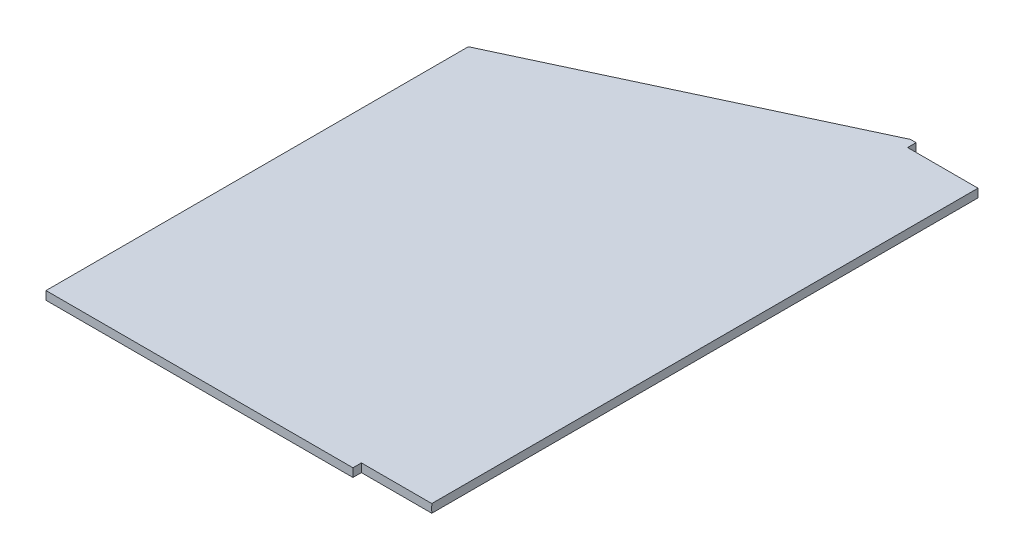
ISO-10303-21;
HEADER;
FILE_DESCRIPTION(('STEP AP214'),'2;1');
FILE_NAME('part.step','',(''),(''),'','','');
FILE_SCHEMA(('AUTOMOTIVE_DESIGN { 1 0 10303 214 1 1 1 1 }'));
ENDSEC;
DATA;
#1=APPLICATION_CONTEXT('core data for automotive mechanical design processes');
#2=APPLICATION_PROTOCOL_DEFINITION('international standard','automotive_design',2000,#1);
#3=PRODUCT_CONTEXT('',#1,'mechanical');
#4=PRODUCT('Part','Part','',(#3));
#5=PRODUCT_RELATED_PRODUCT_CATEGORY('part','',(#4));
#6=PRODUCT_DEFINITION_FORMATION('','',#4);
#7=PRODUCT_DEFINITION_CONTEXT('part definition',#1,'design');
#8=PRODUCT_DEFINITION('design','',#6,#7);
#9=PRODUCT_DEFINITION_SHAPE('','',#8);
#10=(LENGTH_UNIT() NAMED_UNIT(*) SI_UNIT(.MILLI.,.METRE.));
#11=(NAMED_UNIT(*) PLANE_ANGLE_UNIT() SI_UNIT($,.RADIAN.));
#12=(NAMED_UNIT(*) SI_UNIT($,.STERADIAN.) SOLID_ANGLE_UNIT());
#13=UNCERTAINTY_MEASURE_WITH_UNIT(LENGTH_MEASURE(1.E-05),#10,'distance_accuracy_value','');
#14=(GEOMETRIC_REPRESENTATION_CONTEXT(3) GLOBAL_UNCERTAINTY_ASSIGNED_CONTEXT((#13)) GLOBAL_UNIT_ASSIGNED_CONTEXT((#10,
#11,#12)) REPRESENTATION_CONTEXT('',''));
#15=CARTESIAN_POINT('',(0.,0.,0.));
#16=DIRECTION('',(0.,0.,1.));
#17=DIRECTION('',(1.,0.,0.));
#18=AXIS2_PLACEMENT_3D('',#15,#16,#17);
#19=CARTESIAN_POINT('',(78.2,0.,0.));
#20=DIRECTION('',(0.,0.,-1.));
#21=DIRECTION('',(-1.,0.,0.));
#22=AXIS2_PLACEMENT_3D('',#19,#20,#21);
#23=CYLINDRICAL_SURFACE('',#22,51.2);
#24=CARTESIAN_POINT('',(78.2,0.,-3.));
#25=DIRECTION('',(0.,0.,1.));
#26=DIRECTION('',(1.,0.,0.));
#27=AXIS2_PLACEMENT_3D('',#24,#25,#26);
#28=CIRCLE('',#27,51.2);
#29=CARTESIAN_POINT('',(27.021977373095,-1.5,-3.));
#30=VERTEX_POINT('',#29);
#31=CARTESIAN_POINT('',(27.021977373095,1.5,-3.));
#32=VERTEX_POINT('',#31);
#33=EDGE_CURVE('E55',#30,#32,#28,.F.);
#34=ORIENTED_EDGE('',*,*,#33,.F.);
#35=DIRECTION('',(0.,0.,-1.));
#36=VECTOR('',#35,1.);
#37=CARTESIAN_POINT('',(27.021977373095,-1.5,0.));
#38=LINE('',#37,#36);
#39=CARTESIAN_POINT('',(27.021977373095,-1.5,-197.));
#40=VERTEX_POINT('',#39);
#41=EDGE_CURVE('E165',#40,#30,#38,.F.);
#42=ORIENTED_EDGE('',*,*,#41,.F.);
#43=CARTESIAN_POINT('',(78.2,0.,-197.));
#44=DIRECTION('',(0.,0.,-1.));
#45=DIRECTION('',(-1.,0.,0.));
#46=AXIS2_PLACEMENT_3D('',#43,#44,#45);
#47=CIRCLE('',#46,51.2);
#48=CARTESIAN_POINT('',(27.021977373095,1.5,-197.));
#49=VERTEX_POINT('',#48);
#50=EDGE_CURVE('E158',#49,#40,#47,.F.);
#51=ORIENTED_EDGE('',*,*,#50,.F.);
#52=DIRECTION('',(0.,0.,-1.));
#53=VECTOR('',#52,1.);
#54=CARTESIAN_POINT('',(27.021977373095,1.5,0.));
#55=LINE('',#54,#53);
#56=EDGE_CURVE('E152',#49,#32,#55,.F.);
#57=ORIENTED_EDGE('',*,*,#56,.T.);
#58=EDGE_LOOP('',(#34,#42,#51,#57));
#59=FACE_BOUND('',#58,.T.);
#60=ADVANCED_FACE('F40',(#59),#23,.F.);
#61=CARTESIAN_POINT('',(0.,-1.5,-200.));
#62=DIRECTION('',(-0.423348930736044,0.,-0.905966711775134));
#63=DIRECTION('',(-0.905966711775134,0.,0.423348930736044));
#64=AXIS2_PLACEMENT_3D('',#61,#62,#63);
#65=PLANE('',#64);
#66=DIRECTION('',(0.,1.,0.));
#67=VECTOR('',#66,1.);
#68=CARTESIAN_POINT('',(-107.,-1.5,-150.));
#69=LINE('',#68,#67);
#70=CARTESIAN_POINT('',(-107.,-1.5,-150.));
#71=VERTEX_POINT('',#70);
#72=CARTESIAN_POINT('',(-107.,1.5,-150.));
#73=VERTEX_POINT('',#72);
#74=EDGE_CURVE('E148',#71,#73,#69,.T.);
#75=ORIENTED_EDGE('',*,*,#74,.T.);
#76=DIRECTION('',(-0.905966711775134,0.,0.423348930736044));
#77=VECTOR('',#76,1.);
#78=CARTESIAN_POINT('',(0.,1.5,-200.));
#79=LINE('',#78,#77);
#80=CARTESIAN_POINT('',(0.,1.5,-200.));
#81=VERTEX_POINT('',#80);
#82=EDGE_CURVE('E136',#81,#73,#79,.T.);
#83=ORIENTED_EDGE('',*,*,#82,.F.);
#84=DIRECTION('',(0.,1.,0.));
#85=VECTOR('',#84,1.);
#86=CARTESIAN_POINT('',(0.,-1.5,-200.));
#87=LINE('',#86,#85);
#88=CARTESIAN_POINT('',(0.,-1.5,-200.));
#89=VERTEX_POINT('',#88);
#90=EDGE_CURVE('E149',#89,#81,#87,.T.);
#91=ORIENTED_EDGE('',*,*,#90,.F.);
#92=DIRECTION('',(-0.905966711775134,0.,0.423348930736044));
#93=VECTOR('',#92,1.);
#94=CARTESIAN_POINT('',(0.,-1.5,-200.));
#95=LINE('',#94,#93);
#96=EDGE_CURVE('E134',#89,#71,#95,.T.);
#97=ORIENTED_EDGE('',*,*,#96,.T.);
#98=EDGE_LOOP('',(#75,#83,#91,#97));
#99=FACE_BOUND('',#98,.T.);
#100=ADVANCED_FACE('F42',(#99),#65,.T.);
#101=CARTESIAN_POINT('',(0.,-1.5,-200.));
#102=DIRECTION('',(0.,0.,-1.));
#103=DIRECTION('',(-1.,0.,0.));
#104=AXIS2_PLACEMENT_3D('',#101,#102,#103);
#105=PLANE('',#104);
#106=CARTESIAN_POINT('',(78.2,0.,-200.));
#107=DIRECTION('',(0.,0.,-1.));
#108=DIRECTION('',(-1.,0.,0.));
#109=AXIS2_PLACEMENT_3D('',#106,#107,#108);
#110=CIRCLE('',#109,76.2);
#111=CARTESIAN_POINT('',(2.01476521004874,-1.5,-200.));
#112=VERTEX_POINT('',#111);
#113=CARTESIAN_POINT('',(2.01476521004874,1.5,-200.));
#114=VERTEX_POINT('',#113);
#115=EDGE_CURVE('E193',#112,#114,#110,.T.);
#116=ORIENTED_EDGE('',*,*,#115,.F.);
#117=DIRECTION('',(-1.,0.,0.));
#118=VECTOR('',#117,1.);
#119=CARTESIAN_POINT('',(0.,-1.5,-200.));
#120=LINE('',#119,#118);
#121=EDGE_CURVE('E146',#112,#89,#120,.T.);
#122=ORIENTED_EDGE('',*,*,#121,.T.);
#123=ORIENTED_EDGE('',*,*,#90,.T.);
#124=DIRECTION('',(-1.,0.,0.));
#125=VECTOR('',#124,1.);
#126=CARTESIAN_POINT('',(0.,1.5,-200.));
#127=LINE('',#126,#125);
#128=EDGE_CURVE('E132',#114,#81,#127,.T.);
#129=ORIENTED_EDGE('',*,*,#128,.F.);
#130=EDGE_LOOP('',(#116,#122,#123,#129));
#131=FACE_BOUND('',#130,.T.);
#132=ADVANCED_FACE('F201',(#131),#105,.T.);
#133=CARTESIAN_POINT('',(0.,-1.5,0.));
#134=DIRECTION('',(0.,0.,1.));
#135=DIRECTION('',(1.,0.,0.));
#136=AXIS2_PLACEMENT_3D('',#133,#134,#135);
#137=PLANE('',#136);
#138=CARTESIAN_POINT('',(78.2,0.,0.));
#139=DIRECTION('',(0.,0.,1.));
#140=DIRECTION('',(1.,0.,0.));
#141=AXIS2_PLACEMENT_3D('',#138,#139,#140);
#142=CIRCLE('',#141,76.2);
#143=CARTESIAN_POINT('',(2.01476521004869,1.5,0.));
#144=VERTEX_POINT('',#143);
#145=CARTESIAN_POINT('',(2.01476521004869,-1.5,0.));
#146=VERTEX_POINT('',#145);
#147=EDGE_CURVE('E113',#144,#146,#142,.T.);
#148=ORIENTED_EDGE('',*,*,#147,.F.);
#149=DIRECTION('',(1.,0.,0.));
#150=VECTOR('',#149,1.);
#151=CARTESIAN_POINT('',(-107.,1.5,0.));
#152=LINE('',#151,#150);
#153=CARTESIAN_POINT('',(-107.,1.5,0.));
#154=VERTEX_POINT('',#153);
#155=EDGE_CURVE('E123',#154,#144,#152,.T.);
#156=ORIENTED_EDGE('',*,*,#155,.F.);
#157=DIRECTION('',(0.,1.,0.));
#158=VECTOR('',#157,1.);
#159=CARTESIAN_POINT('',(-107.,-1.5,0.));
#160=LINE('',#159,#158);
#161=CARTESIAN_POINT('',(-107.,-1.5,0.));
#162=VERTEX_POINT('',#161);
#163=EDGE_CURVE('E153',#162,#154,#160,.T.);
#164=ORIENTED_EDGE('',*,*,#163,.F.);
#165=DIRECTION('',(1.,0.,0.));
#166=VECTOR('',#165,1.);
#167=CARTESIAN_POINT('',(-107.,-1.5,0.));
#168=LINE('',#167,#166);
#169=EDGE_CURVE('E125',#162,#146,#168,.T.);
#170=ORIENTED_EDGE('',*,*,#169,.T.);
#171=EDGE_LOOP('',(#148,#156,#164,#170));
#172=FACE_BOUND('',#171,.T.);
#173=ADVANCED_FACE('F122',(#172),#137,.T.);
#174=CARTESIAN_POINT('',(-107.,-1.5,-150.));
#175=DIRECTION('',(-1.,0.,0.));
#176=DIRECTION('',(0.,0.,1.));
#177=AXIS2_PLACEMENT_3D('',#174,#175,#176);
#178=PLANE('',#177);
#179=ORIENTED_EDGE('',*,*,#163,.T.);
#180=DIRECTION('',(0.,0.,1.));
#181=VECTOR('',#180,1.);
#182=CARTESIAN_POINT('',(-107.,1.5,-150.));
#183=LINE('',#182,#181);
#184=EDGE_CURVE('E131',#73,#154,#183,.T.);
#185=ORIENTED_EDGE('',*,*,#184,.F.);
#186=ORIENTED_EDGE('',*,*,#74,.F.);
#187=DIRECTION('',(0.,0.,1.));
#188=VECTOR('',#187,1.);
#189=CARTESIAN_POINT('',(-107.,-1.5,-150.));
#190=LINE('',#189,#188);
#191=EDGE_CURVE('E142',#71,#162,#190,.T.);
#192=ORIENTED_EDGE('',*,*,#191,.T.);
#193=EDGE_LOOP('',(#179,#185,#186,#192));
#194=FACE_BOUND('',#193,.T.);
#195=ADVANCED_FACE('F190',(#194),#178,.T.);
#196=CARTESIAN_POINT('',(0.,-1.5,0.));
#197=DIRECTION('',(0.,1.,0.));
#198=DIRECTION('',(0.,0.,1.));
#199=AXIS2_PLACEMENT_3D('',#196,#197,#198);
#200=PLANE('',#199);
#201=DIRECTION('',(1.,0.,0.));
#202=VECTOR('',#201,1.);
#203=CARTESIAN_POINT('',(0.,-1.5,-3.));
#204=LINE('',#203,#202);
#205=CARTESIAN_POINT('',(2.01476521004869,-1.5,-3.));
#206=VERTEX_POINT('',#205);
#207=EDGE_CURVE('E192',#206,#30,#204,.T.);
#208=ORIENTED_EDGE('',*,*,#207,.F.);
#209=DIRECTION('',(0.,0.,1.));
#210=VECTOR('',#209,1.);
#211=CARTESIAN_POINT('',(2.01476521004869,-1.5,-3.));
#212=LINE('',#211,#210);
#213=EDGE_CURVE('E191',#206,#146,#212,.T.);
#214=ORIENTED_EDGE('',*,*,#213,.T.);
#215=ORIENTED_EDGE('',*,*,#169,.F.);
#216=ORIENTED_EDGE('',*,*,#191,.F.);
#217=ORIENTED_EDGE('',*,*,#96,.F.);
#218=ORIENTED_EDGE('',*,*,#121,.F.);
#219=DIRECTION('',(0.,0.,-1.));
#220=VECTOR('',#219,1.);
#221=CARTESIAN_POINT('',(2.01476521004874,-1.5,-197.));
#222=LINE('',#221,#220);
#223=CARTESIAN_POINT('',(2.01476521004874,-1.5,-197.));
#224=VERTEX_POINT('',#223);
#225=EDGE_CURVE('E175',#112,#224,#222,.F.);
#226=ORIENTED_EDGE('',*,*,#225,.T.);
#227=DIRECTION('',(-1.,0.,0.));
#228=VECTOR('',#227,1.);
#229=CARTESIAN_POINT('',(0.,-1.5,-197.));
#230=LINE('',#229,#228);
#231=EDGE_CURVE('E168',#40,#224,#230,.T.);
#232=ORIENTED_EDGE('',*,*,#231,.F.);
#233=ORIENTED_EDGE('',*,*,#41,.T.);
#234=EDGE_LOOP('',(#208,#214,#215,#216,#217,#218,#226,#232,#233));
#235=FACE_BOUND('',#234,.T.);
#236=ADVANCED_FACE('F173',(#235),#200,.F.);
#237=CARTESIAN_POINT('',(0.,1.5,0.));
#238=DIRECTION('',(0.,1.,0.));
#239=DIRECTION('',(0.,0.,1.));
#240=AXIS2_PLACEMENT_3D('',#237,#238,#239);
#241=PLANE('',#240);
#242=DIRECTION('',(0.,0.,1.));
#243=VECTOR('',#242,1.);
#244=CARTESIAN_POINT('',(2.01476521004869,1.5,-3.));
#245=LINE('',#244,#243);
#246=CARTESIAN_POINT('',(2.01476521004869,1.5,-3.));
#247=VERTEX_POINT('',#246);
#248=EDGE_CURVE('E11',#247,#144,#245,.T.);
#249=ORIENTED_EDGE('',*,*,#248,.F.);
#250=DIRECTION('',(1.,0.,0.));
#251=VECTOR('',#250,1.);
#252=CARTESIAN_POINT('',(0.,1.5,-3.));
#253=LINE('',#252,#251);
#254=EDGE_CURVE('E48',#247,#32,#253,.T.);
#255=ORIENTED_EDGE('',*,*,#254,.T.);
#256=ORIENTED_EDGE('',*,*,#56,.F.);
#257=DIRECTION('',(-1.,0.,0.));
#258=VECTOR('',#257,1.);
#259=CARTESIAN_POINT('',(0.,1.5,-197.));
#260=LINE('',#259,#258);
#261=CARTESIAN_POINT('',(2.01476521004874,1.5,-197.));
#262=VERTEX_POINT('',#261);
#263=EDGE_CURVE('E63',#49,#262,#260,.T.);
#264=ORIENTED_EDGE('',*,*,#263,.T.);
#265=DIRECTION('',(0.,0.,-1.));
#266=VECTOR('',#265,1.);
#267=CARTESIAN_POINT('',(2.01476521004874,1.5,-197.));
#268=LINE('',#267,#266);
#269=EDGE_CURVE('E160',#114,#262,#268,.F.);
#270=ORIENTED_EDGE('',*,*,#269,.F.);
#271=ORIENTED_EDGE('',*,*,#128,.T.);
#272=ORIENTED_EDGE('',*,*,#82,.T.);
#273=ORIENTED_EDGE('',*,*,#184,.T.);
#274=ORIENTED_EDGE('',*,*,#155,.T.);
#275=EDGE_LOOP('',(#249,#255,#256,#264,#270,#271,#272,#273,#274));
#276=FACE_BOUND('',#275,.T.);
#277=ADVANCED_FACE('F128',(#276),#241,.T.);
#278=CARTESIAN_POINT('',(78.2,0.,-197.));
#279=DIRECTION('',(0.,0.,-1.));
#280=DIRECTION('',(-1.,0.,0.));
#281=AXIS2_PLACEMENT_3D('',#278,#279,#280);
#282=CYLINDRICAL_SURFACE('',#281,76.2);
#283=ORIENTED_EDGE('',*,*,#115,.T.);
#284=ORIENTED_EDGE('',*,*,#269,.T.);
#285=CARTESIAN_POINT('',(78.2,0.,-197.));
#286=DIRECTION('',(0.,0.,-1.));
#287=DIRECTION('',(-1.,0.,0.));
#288=AXIS2_PLACEMENT_3D('',#285,#286,#287);
#289=CIRCLE('',#288,76.2);
#290=EDGE_CURVE('E178',#224,#262,#289,.T.);
#291=ORIENTED_EDGE('',*,*,#290,.F.);
#292=ORIENTED_EDGE('',*,*,#225,.F.);
#293=EDGE_LOOP('',(#283,#284,#291,#292));
#294=FACE_BOUND('',#293,.T.);
#295=ADVANCED_FACE('F202',(#294),#282,.F.);
#296=CARTESIAN_POINT('',(78.2,0.,-197.));
#297=DIRECTION('',(0.,0.,-1.));
#298=DIRECTION('',(-1.,0.,0.));
#299=AXIS2_PLACEMENT_3D('',#296,#297,#298);
#300=PLANE('',#299);
#301=ORIENTED_EDGE('',*,*,#231,.T.);
#302=ORIENTED_EDGE('',*,*,#290,.T.);
#303=ORIENTED_EDGE('',*,*,#263,.F.);
#304=ORIENTED_EDGE('',*,*,#50,.T.);
#305=EDGE_LOOP('',(#301,#302,#303,#304));
#306=FACE_BOUND('',#305,.T.);
#307=ADVANCED_FACE('F167',(#306),#300,.T.);
#308=CARTESIAN_POINT('',(78.2,0.,-3.));
#309=DIRECTION('',(0.,0.,1.));
#310=DIRECTION('',(1.,0.,0.));
#311=AXIS2_PLACEMENT_3D('',#308,#309,#310);
#312=CYLINDRICAL_SURFACE('',#311,76.2);
#313=CARTESIAN_POINT('',(78.2,0.,-3.));
#314=DIRECTION('',(0.,0.,1.));
#315=DIRECTION('',(1.,0.,0.));
#316=AXIS2_PLACEMENT_3D('',#313,#314,#315);
#317=CIRCLE('',#316,76.2);
#318=EDGE_CURVE('E116',#247,#206,#317,.T.);
#319=ORIENTED_EDGE('',*,*,#318,.F.);
#320=ORIENTED_EDGE('',*,*,#248,.T.);
#321=ORIENTED_EDGE('',*,*,#147,.T.);
#322=ORIENTED_EDGE('',*,*,#213,.F.);
#323=EDGE_LOOP('',(#319,#320,#321,#322));
#324=FACE_BOUND('',#323,.T.);
#325=ADVANCED_FACE('F112',(#324),#312,.F.);
#326=CARTESIAN_POINT('',(78.2,0.,-3.));
#327=DIRECTION('',(0.,0.,1.));
#328=DIRECTION('',(1.,0.,0.));
#329=AXIS2_PLACEMENT_3D('',#326,#327,#328);
#330=PLANE('',#329);
#331=ORIENTED_EDGE('',*,*,#207,.T.);
#332=ORIENTED_EDGE('',*,*,#33,.T.);
#333=ORIENTED_EDGE('',*,*,#254,.F.);
#334=ORIENTED_EDGE('',*,*,#318,.T.);
#335=EDGE_LOOP('',(#331,#332,#333,#334));
#336=FACE_BOUND('',#335,.T.);
#337=ADVANCED_FACE('F251',(#336),#330,.T.);
#338=CLOSED_SHELL('',(#60,#100,#132,#173,#195,#236,#277,#295,#307,#325,#337));
#339=MANIFOLD_SOLID_BREP('B2',#338);
#340=ADVANCED_BREP_SHAPE_REPRESENTATION('',(#18,#339),#14);
#341=SHAPE_DEFINITION_REPRESENTATION(#9,#340);
ENDSEC;
END-ISO-10303-21;
